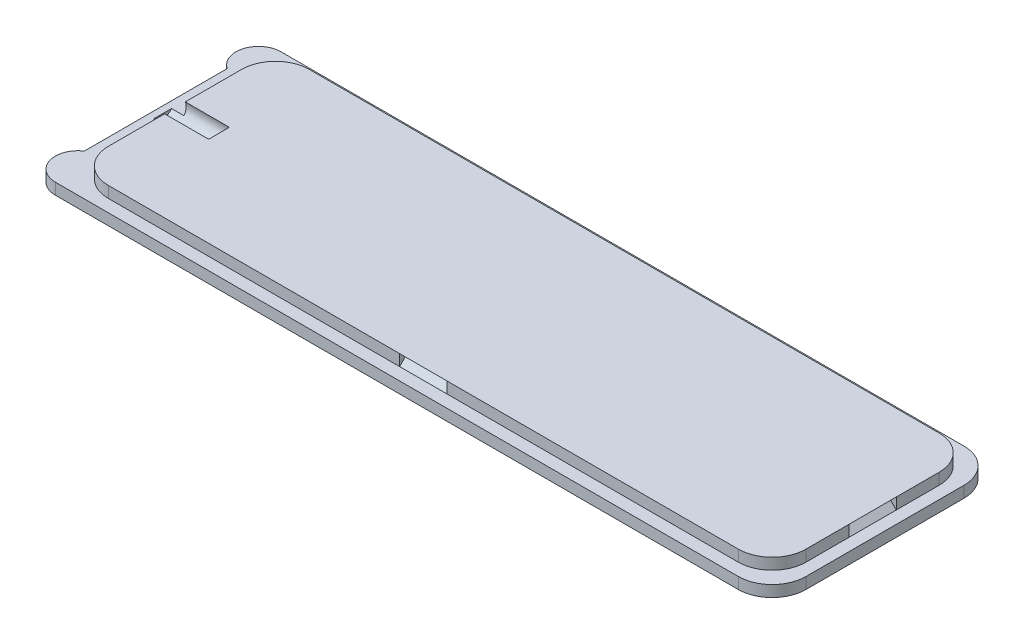
ISO-10303-21;
HEADER;
FILE_DESCRIPTION(('STEP AP214'),'2;1');
FILE_NAME('part.step','',(''),(''),'','','');
FILE_SCHEMA(('AUTOMOTIVE_DESIGN { 1 0 10303 214 1 1 1 1 }'));
ENDSEC;
DATA;
#1=APPLICATION_CONTEXT('core data for automotive mechanical design processes');
#2=APPLICATION_PROTOCOL_DEFINITION('international standard','automotive_design',2000,#1);
#3=PRODUCT_CONTEXT('',#1,'mechanical');
#4=PRODUCT('Part','Part','',(#3));
#5=PRODUCT_RELATED_PRODUCT_CATEGORY('part','',(#4));
#6=PRODUCT_DEFINITION_FORMATION('','',#4);
#7=PRODUCT_DEFINITION_CONTEXT('part definition',#1,'design');
#8=PRODUCT_DEFINITION('design','',#6,#7);
#9=PRODUCT_DEFINITION_SHAPE('','',#8);
#10=(LENGTH_UNIT() NAMED_UNIT(*) SI_UNIT(.MILLI.,.METRE.));
#11=(NAMED_UNIT(*) PLANE_ANGLE_UNIT() SI_UNIT($,.RADIAN.));
#12=(NAMED_UNIT(*) SI_UNIT($,.STERADIAN.) SOLID_ANGLE_UNIT());
#13=UNCERTAINTY_MEASURE_WITH_UNIT(LENGTH_MEASURE(1.E-05),#10,'distance_accuracy_value','');
#14=(GEOMETRIC_REPRESENTATION_CONTEXT(3) GLOBAL_UNCERTAINTY_ASSIGNED_CONTEXT((#13)) GLOBAL_UNIT_ASSIGNED_CONTEXT((#10,
#11,#12)) REPRESENTATION_CONTEXT('',''));
#15=CARTESIAN_POINT('',(0.,0.,0.));
#16=DIRECTION('',(0.,0.,1.));
#17=DIRECTION('',(1.,0.,0.));
#18=AXIS2_PLACEMENT_3D('',#15,#16,#17);
#19=CARTESIAN_POINT('',(305.,5.,-85.));
#20=DIRECTION('',(0.,-1.,0.));
#21=DIRECTION('',(0.,0.,-1.));
#22=AXIS2_PLACEMENT_3D('',#19,#20,#21);
#23=PLANE('',#22);
#24=DIRECTION('',(0.,0.,1.));
#25=VECTOR('',#24,1.);
#26=CARTESIAN_POINT('',(-3.,5.,0.));
#27=LINE('',#26,#25);
#28=CARTESIAN_POINT('',(-3.,5.,-81.6483534557551));
#29=VERTEX_POINT('',#28);
#30=CARTESIAN_POINT('',(-3.,5.,-18.351646544245));
#31=VERTEX_POINT('',#30);
#32=EDGE_CURVE('E272',#29,#31,#27,.T.);
#33=ORIENTED_EDGE('',*,*,#32,.T.);
#34=CARTESIAN_POINT('',(2.50000000000012,5.,-10.));
#35=DIRECTION('',(0.,1.,0.));
#36=DIRECTION('',(0.,0.,1.));
#37=AXIS2_PLACEMENT_3D('',#34,#35,#36);
#38=CIRCLE('',#37,10.);
#39=CARTESIAN_POINT('',(2.50000000000019,5.,0.));
#40=VERTEX_POINT('',#39);
#41=EDGE_CURVE('E255',#40,#31,#38,.F.);
#42=ORIENTED_EDGE('',*,*,#41,.F.);
#43=DIRECTION('',(1.,0.,0.));
#44=VECTOR('',#43,1.);
#45=CARTESIAN_POINT('',(15.0000000000001,5.,0.));
#46=LINE('',#45,#44);
#47=CARTESIAN_POINT('',(305.,5.,0.));
#48=VERTEX_POINT('',#47);
#49=EDGE_CURVE('E522',#40,#48,#46,.T.);
#50=ORIENTED_EDGE('',*,*,#49,.T.);
#51=CARTESIAN_POINT('',(305.,5.,-15.));
#52=DIRECTION('',(0.,1.,0.));
#53=DIRECTION('',(0.,0.,-1.));
#54=AXIS2_PLACEMENT_3D('',#51,#52,#53);
#55=CIRCLE('',#54,15.);
#56=CARTESIAN_POINT('',(320.,5.,-15.0000000000001));
#57=VERTEX_POINT('',#56);
#58=EDGE_CURVE('E525',#48,#57,#55,.T.);
#59=ORIENTED_EDGE('',*,*,#58,.T.);
#60=DIRECTION('',(0.,0.,-1.));
#61=VECTOR('',#60,1.);
#62=CARTESIAN_POINT('',(320.,5.,-15.0000000000001));
#63=LINE('',#62,#61);
#64=CARTESIAN_POINT('',(320.,5.,-84.9999999999999));
#65=VERTEX_POINT('',#64);
#66=EDGE_CURVE('E528',#57,#65,#63,.T.);
#67=ORIENTED_EDGE('',*,*,#66,.T.);
#68=CARTESIAN_POINT('',(305.,5.,-85.));
#69=DIRECTION('',(0.,1.,0.));
#70=DIRECTION('',(0.,0.,-1.));
#71=AXIS2_PLACEMENT_3D('',#68,#69,#70);
#72=CIRCLE('',#71,15.);
#73=CARTESIAN_POINT('',(305.,5.,-100.));
#74=VERTEX_POINT('',#73);
#75=EDGE_CURVE('E493',#65,#74,#72,.T.);
#76=ORIENTED_EDGE('',*,*,#75,.T.);
#77=DIRECTION('',(-1.,0.,0.));
#78=VECTOR('',#77,1.);
#79=CARTESIAN_POINT('',(15.0000000000001,5.,-100.));
#80=LINE('',#79,#78);
#81=CARTESIAN_POINT('',(2.50000000000017,5.,-100.));
#82=VERTEX_POINT('',#81);
#83=EDGE_CURVE('E519',#74,#82,#80,.T.);
#84=ORIENTED_EDGE('',*,*,#83,.T.);
#85=CARTESIAN_POINT('',(2.5000000000001,5.,-90.));
#86=DIRECTION('',(0.,1.,0.));
#87=DIRECTION('',(0.,0.,1.));
#88=AXIS2_PLACEMENT_3D('',#85,#86,#87);
#89=CIRCLE('',#88,9.99999999999999);
#90=EDGE_CURVE('E281',#29,#82,#89,.F.);
#91=ORIENTED_EDGE('',*,*,#90,.F.);
#92=EDGE_LOOP('',(#33,#42,#50,#59,#67,#76,#84,#91));
#93=FACE_BOUND('',#92,.T.);
#94=DIRECTION('',(0.,0.,-1.));
#95=VECTOR('',#94,1.);
#96=CARTESIAN_POINT('',(0.,5.,-15.0000000000001));
#97=LINE('',#96,#95);
#98=CARTESIAN_POINT('',(0.,5.,-46.));
#99=VERTEX_POINT('',#98);
#100=CARTESIAN_POINT('',(0.,5.,-54.));
#101=VERTEX_POINT('',#100);
#102=EDGE_CURVE('E295',#99,#101,#97,.T.);
#103=ORIENTED_EDGE('',*,*,#102,.T.);
#104=DIRECTION('',(-1.,0.,0.));
#105=VECTOR('',#104,1.);
#106=CARTESIAN_POINT('',(25.,5.,-54.));
#107=LINE('',#106,#105);
#108=CARTESIAN_POINT('',(5.5,5.,-54.));
#109=VERTEX_POINT('',#108);
#110=EDGE_CURVE('E316',#109,#101,#107,.T.);
#111=ORIENTED_EDGE('',*,*,#110,.F.);
#112=DIRECTION('',(0.,0.,1.));
#113=VECTOR('',#112,1.);
#114=CARTESIAN_POINT('',(5.5,5.,-79.4999999999999));
#115=LINE('',#114,#113);
#116=CARTESIAN_POINT('',(5.5,5.,-79.4999999999999));
#117=VERTEX_POINT('',#116);
#118=EDGE_CURVE('E432',#117,#109,#115,.T.);
#119=ORIENTED_EDGE('',*,*,#118,.F.);
#120=CARTESIAN_POINT('',(20.5,5.,-79.5));
#121=DIRECTION('',(0.,1.,0.));
#122=DIRECTION('',(0.,0.,-1.));
#123=AXIS2_PLACEMENT_3D('',#120,#121,#122);
#124=CIRCLE('',#123,15.);
#125=CARTESIAN_POINT('',(20.5000000000001,5.,-94.5));
#126=VERTEX_POINT('',#125);
#127=EDGE_CURVE('E427',#126,#117,#124,.T.);
#128=ORIENTED_EDGE('',*,*,#127,.F.);
#129=DIRECTION('',(-1.,0.,0.));
#130=VECTOR('',#129,1.);
#131=CARTESIAN_POINT('',(20.5000000000001,5.,-94.5));
#132=LINE('',#131,#130);
#133=CARTESIAN_POINT('',(149.5,5.,-94.5));
#134=VERTEX_POINT('',#133);
#135=EDGE_CURVE('E421',#134,#126,#132,.T.);
#136=ORIENTED_EDGE('',*,*,#135,.F.);
#137=DIRECTION('',(-1.,0.,0.));
#138=VECTOR('',#137,1.);
#139=CARTESIAN_POINT('',(170.5,5.,-94.5));
#140=LINE('',#139,#138);
#141=CARTESIAN_POINT('',(170.5,5.,-94.5));
#142=VERTEX_POINT('',#141);
#143=EDGE_CURVE('E381',#142,#134,#140,.T.);
#144=ORIENTED_EDGE('',*,*,#143,.F.);
#145=CARTESIAN_POINT('',(299.5,5.,-94.5));
#146=VERTEX_POINT('',#145);
#147=EDGE_CURVE('E423',#146,#142,#132,.T.);
#148=ORIENTED_EDGE('',*,*,#147,.F.);
#149=CARTESIAN_POINT('',(299.5,5.,-79.5));
#150=DIRECTION('',(0.,1.,0.));
#151=DIRECTION('',(0.,0.,-1.));
#152=AXIS2_PLACEMENT_3D('',#149,#150,#151);
#153=CIRCLE('',#152,15.);
#154=CARTESIAN_POINT('',(314.5,5.,-79.4999999999999));
#155=VERTEX_POINT('',#154);
#156=EDGE_CURVE('E417',#155,#146,#153,.T.);
#157=ORIENTED_EDGE('',*,*,#156,.F.);
#158=DIRECTION('',(0.,0.,-1.));
#159=VECTOR('',#158,1.);
#160=CARTESIAN_POINT('',(314.5,5.,-79.4999999999999));
#161=LINE('',#160,#159);
#162=CARTESIAN_POINT('',(314.5,5.,-60.5));
#163=VERTEX_POINT('',#162);
#164=EDGE_CURVE('E449',#163,#155,#161,.T.);
#165=ORIENTED_EDGE('',*,*,#164,.F.);
#166=DIRECTION('',(0.,0.,-1.));
#167=VECTOR('',#166,1.);
#168=CARTESIAN_POINT('',(314.5,5.,-39.5));
#169=LINE('',#168,#167);
#170=CARTESIAN_POINT('',(314.5,5.,-39.5));
#171=VERTEX_POINT('',#170);
#172=EDGE_CURVE('E350',#171,#163,#169,.T.);
#173=ORIENTED_EDGE('',*,*,#172,.F.);
#174=CARTESIAN_POINT('',(314.5,5.,-20.5000000000001));
#175=VERTEX_POINT('',#174);
#176=EDGE_CURVE('E450',#175,#171,#161,.T.);
#177=ORIENTED_EDGE('',*,*,#176,.F.);
#178=CARTESIAN_POINT('',(299.5,5.,-20.5));
#179=DIRECTION('',(0.,1.,0.));
#180=DIRECTION('',(0.,0.,-1.));
#181=AXIS2_PLACEMENT_3D('',#178,#179,#180);
#182=CIRCLE('',#181,15.);
#183=CARTESIAN_POINT('',(299.5,5.,-5.5));
#184=VERTEX_POINT('',#183);
#185=EDGE_CURVE('E445',#184,#175,#182,.T.);
#186=ORIENTED_EDGE('',*,*,#185,.F.);
#187=DIRECTION('',(1.,0.,0.));
#188=VECTOR('',#187,1.);
#189=CARTESIAN_POINT('',(20.5000000000001,5.,-5.5));
#190=LINE('',#189,#188);
#191=CARTESIAN_POINT('',(170.5,5.,-5.5));
#192=VERTEX_POINT('',#191);
#193=EDGE_CURVE('E440',#192,#184,#190,.T.);
#194=ORIENTED_EDGE('',*,*,#193,.F.);
#195=DIRECTION('',(-1.,0.,0.));
#196=VECTOR('',#195,1.);
#197=CARTESIAN_POINT('',(170.5,5.,-5.5));
#198=LINE('',#197,#196);
#199=CARTESIAN_POINT('',(149.5,5.,-5.5));
#200=VERTEX_POINT('',#199);
#201=EDGE_CURVE('E390',#192,#200,#198,.T.);
#202=ORIENTED_EDGE('',*,*,#201,.T.);
#203=CARTESIAN_POINT('',(20.5000000000001,5.,-5.5));
#204=VERTEX_POINT('',#203);
#205=EDGE_CURVE('E441',#204,#200,#190,.T.);
#206=ORIENTED_EDGE('',*,*,#205,.F.);
#207=CARTESIAN_POINT('',(20.5,5.,-20.5));
#208=DIRECTION('',(0.,1.,0.));
#209=DIRECTION('',(0.,0.,-1.));
#210=AXIS2_PLACEMENT_3D('',#207,#208,#209);
#211=CIRCLE('',#210,15.);
#212=CARTESIAN_POINT('',(5.50000000000001,5.,-20.5000000000001));
#213=VERTEX_POINT('',#212);
#214=EDGE_CURVE('E436',#213,#204,#211,.T.);
#215=ORIENTED_EDGE('',*,*,#214,.F.);
#216=CARTESIAN_POINT('',(5.50000000000001,5.,-46.));
#217=VERTEX_POINT('',#216);
#218=EDGE_CURVE('E431',#217,#213,#115,.T.);
#219=ORIENTED_EDGE('',*,*,#218,.F.);
#220=DIRECTION('',(-1.,0.,0.));
#221=VECTOR('',#220,1.);
#222=CARTESIAN_POINT('',(25.,5.,-46.));
#223=LINE('',#222,#221);
#224=EDGE_CURVE('E320',#99,#217,#223,.F.);
#225=ORIENTED_EDGE('',*,*,#224,.F.);
#226=EDGE_LOOP('',(#103,#111,#119,#128,#136,#144,#148,#157,#165,#173,#177,#186,#194,#202,#206,
#215,#219,#225));
#227=FACE_BOUND('',#226,.T.);
#228=ADVANCED_FACE('F64',(#93,#227),#23,.F.);
#229=CARTESIAN_POINT('',(15.0000000000001,10.,-100.));
#230=DIRECTION('',(0.,0.,1.));
#231=DIRECTION('',(1.,0.,0.));
#232=AXIS2_PLACEMENT_3D('',#229,#230,#231);
#233=PLANE('',#232);
#234=DIRECTION('',(0.,-1.,0.));
#235=VECTOR('',#234,1.);
#236=CARTESIAN_POINT('',(2.50000000000017,5.,-100.));
#237=LINE('',#236,#235);
#238=CARTESIAN_POINT('',(2.50000000000017,0.,-100.));
#239=VERTEX_POINT('',#238);
#240=EDGE_CURVE('E292',#82,#239,#237,.T.);
#241=ORIENTED_EDGE('',*,*,#240,.F.);
#242=ORIENTED_EDGE('',*,*,#83,.F.);
#243=DIRECTION('',(0.,-1.,0.));
#244=VECTOR('',#243,1.);
#245=CARTESIAN_POINT('',(305.,10.,-100.));
#246=LINE('',#245,#244);
#247=CARTESIAN_POINT('',(305.,0.,-100.));
#248=VERTEX_POINT('',#247);
#249=EDGE_CURVE('E560',#74,#248,#246,.T.);
#250=ORIENTED_EDGE('',*,*,#249,.T.);
#251=DIRECTION('',(-1.,0.,0.));
#252=VECTOR('',#251,1.);
#253=CARTESIAN_POINT('',(15.0000000000001,0.,-100.));
#254=LINE('',#253,#252);
#255=EDGE_CURVE('E535',#248,#239,#254,.T.);
#256=ORIENTED_EDGE('',*,*,#255,.T.);
#257=EDGE_LOOP('',(#241,#242,#250,#256));
#258=FACE_BOUND('',#257,.T.);
#259=ADVANCED_FACE('F606',(#258),#233,.F.);
#260=CARTESIAN_POINT('',(305.,0.,-85.));
#261=DIRECTION('',(0.,-1.,0.));
#262=DIRECTION('',(0.,0.,-1.));
#263=AXIS2_PLACEMENT_3D('',#260,#261,#262);
#264=PLANE('',#263);
#265=CARTESIAN_POINT('',(2.50000000000012,0.,-10.));
#266=DIRECTION('',(0.,1.,0.));
#267=DIRECTION('',(0.,0.,1.));
#268=AXIS2_PLACEMENT_3D('',#265,#266,#267);
#269=CIRCLE('',#268,10.);
#270=CARTESIAN_POINT('',(2.50000000000019,0.,0.));
#271=VERTEX_POINT('',#270);
#272=CARTESIAN_POINT('',(-3.,0.,-18.351646544245));
#273=VERTEX_POINT('',#272);
#274=EDGE_CURVE('E266',#271,#273,#269,.F.);
#275=ORIENTED_EDGE('',*,*,#274,.T.);
#276=DIRECTION('',(0.,0.,1.));
#277=VECTOR('',#276,1.);
#278=CARTESIAN_POINT('',(-3.,0.,0.));
#279=LINE('',#278,#277);
#280=CARTESIAN_POINT('',(-3.,0.,-81.6483534557551));
#281=VERTEX_POINT('',#280);
#282=EDGE_CURVE('E274',#281,#273,#279,.T.);
#283=ORIENTED_EDGE('',*,*,#282,.F.);
#284=CARTESIAN_POINT('',(2.5000000000001,0.,-90.));
#285=DIRECTION('',(0.,1.,0.));
#286=DIRECTION('',(0.,0.,1.));
#287=AXIS2_PLACEMENT_3D('',#284,#285,#286);
#288=CIRCLE('',#287,9.99999999999999);
#289=EDGE_CURVE('E276',#281,#239,#288,.F.);
#290=ORIENTED_EDGE('',*,*,#289,.T.);
#291=ORIENTED_EDGE('',*,*,#255,.F.);
#292=CARTESIAN_POINT('',(305.,0.,-85.));
#293=DIRECTION('',(0.,1.,0.));
#294=DIRECTION('',(0.,0.,-1.));
#295=AXIS2_PLACEMENT_3D('',#292,#293,#294);
#296=CIRCLE('',#295,15.);
#297=CARTESIAN_POINT('',(320.,0.,-84.9999999999999));
#298=VERTEX_POINT('',#297);
#299=EDGE_CURVE('E531',#298,#248,#296,.T.);
#300=ORIENTED_EDGE('',*,*,#299,.F.);
#301=DIRECTION('',(0.,0.,-1.));
#302=VECTOR('',#301,1.);
#303=CARTESIAN_POINT('',(320.,0.,-15.0000000000001));
#304=LINE('',#303,#302);
#305=CARTESIAN_POINT('',(320.,0.,-15.0000000000001));
#306=VERTEX_POINT('',#305);
#307=EDGE_CURVE('E546',#306,#298,#304,.T.);
#308=ORIENTED_EDGE('',*,*,#307,.F.);
#309=CARTESIAN_POINT('',(305.,0.,-15.));
#310=DIRECTION('',(0.,1.,0.));
#311=DIRECTION('',(0.,0.,-1.));
#312=AXIS2_PLACEMENT_3D('',#309,#310,#311);
#313=CIRCLE('',#312,15.);
#314=CARTESIAN_POINT('',(305.,0.,0.));
#315=VERTEX_POINT('',#314);
#316=EDGE_CURVE('E542',#315,#306,#313,.T.);
#317=ORIENTED_EDGE('',*,*,#316,.F.);
#318=DIRECTION('',(1.,0.,0.));
#319=VECTOR('',#318,1.);
#320=CARTESIAN_POINT('',(15.0000000000001,0.,0.));
#321=LINE('',#320,#319);
#322=EDGE_CURVE('E539',#271,#315,#321,.T.);
#323=ORIENTED_EDGE('',*,*,#322,.F.);
#324=EDGE_LOOP('',(#275,#283,#290,#291,#300,#308,#317,#323));
#325=FACE_BOUND('',#324,.T.);
#326=ADVANCED_FACE('F611',(#325),#264,.T.);
#327=CARTESIAN_POINT('',(5.5,5.,-79.4999999999999));
#328=DIRECTION('',(-1.,0.,0.));
#329=DIRECTION('',(0.,0.,1.));
#330=AXIS2_PLACEMENT_3D('',#327,#328,#329);
#331=PLANE('',#330);
#332=ORIENTED_EDGE('',*,*,#118,.T.);
#333=CARTESIAN_POINT('',(5.50000000000001,7.99999999999999,-50.));
#334=DIRECTION('',(-1.,0.,0.));
#335=DIRECTION('',(0.,0.,1.));
#336=AXIS2_PLACEMENT_3D('',#333,#334,#335);
#337=CIRCLE('',#336,5.);
#338=CARTESIAN_POINT('',(5.50000000000001,10.,-54.5825756949558));
#339=VERTEX_POINT('',#338);
#340=EDGE_CURVE('E309',#109,#339,#337,.F.);
#341=ORIENTED_EDGE('',*,*,#340,.T.);
#342=DIRECTION('',(0.,0.,1.));
#343=VECTOR('',#342,1.);
#344=CARTESIAN_POINT('',(5.5,10.,-79.4999999999999));
#345=LINE('',#344,#343);
#346=CARTESIAN_POINT('',(5.5,10.,-79.4999999999999));
#347=VERTEX_POINT('',#346);
#348=EDGE_CURVE('E468',#347,#339,#345,.T.);
#349=ORIENTED_EDGE('',*,*,#348,.F.);
#350=DIRECTION('',(0.,1.,0.));
#351=VECTOR('',#350,1.);
#352=CARTESIAN_POINT('',(5.5,5.,-79.4999999999999));
#353=LINE('',#352,#351);
#354=EDGE_CURVE('E508',#117,#347,#353,.T.);
#355=ORIENTED_EDGE('',*,*,#354,.F.);
#356=EDGE_LOOP('',(#332,#341,#349,#355));
#357=FACE_BOUND('',#356,.T.);
#358=ADVANCED_FACE('F574',(#357),#331,.T.);
#359=CARTESIAN_POINT('',(305.,10.,-85.));
#360=DIRECTION('',(0.,-1.,0.));
#361=DIRECTION('',(0.,0.,-1.));
#362=AXIS2_PLACEMENT_3D('',#359,#360,#361);
#363=PLANE('',#362);
#364=DIRECTION('',(-1.,0.,0.));
#365=VECTOR('',#364,1.);
#366=CARTESIAN_POINT('',(25.,10.,-45.4174243050442));
#367=LINE('',#366,#365);
#368=CARTESIAN_POINT('',(5.50000000000001,10.,-45.4174243050442));
#369=VERTEX_POINT('',#368);
#370=CARTESIAN_POINT('',(25.,10.,-45.4174243050442));
#371=VERTEX_POINT('',#370);
#372=EDGE_CURVE('E12',#369,#371,#367,.F.);
#373=ORIENTED_EDGE('',*,*,#372,.F.);
#374=CARTESIAN_POINT('',(5.50000000000001,10.,-20.5000000000001));
#375=VERTEX_POINT('',#374);
#376=EDGE_CURVE('E467',#369,#375,#345,.T.);
#377=ORIENTED_EDGE('',*,*,#376,.T.);
#378=CARTESIAN_POINT('',(20.5,10.,-20.5));
#379=DIRECTION('',(0.,1.,0.));
#380=DIRECTION('',(0.,0.,-1.));
#381=AXIS2_PLACEMENT_3D('',#378,#379,#380);
#382=CIRCLE('',#381,15.);
#383=CARTESIAN_POINT('',(20.5000000000001,10.,-5.5));
#384=VERTEX_POINT('',#383);
#385=EDGE_CURVE('E472',#375,#384,#382,.T.);
#386=ORIENTED_EDGE('',*,*,#385,.T.);
#387=DIRECTION('',(1.,0.,0.));
#388=VECTOR('',#387,1.);
#389=CARTESIAN_POINT('',(20.5000000000001,10.,-5.5));
#390=LINE('',#389,#388);
#391=CARTESIAN_POINT('',(149.5,10.,-5.5));
#392=VERTEX_POINT('',#391);
#393=EDGE_CURVE('E477',#384,#392,#390,.T.);
#394=ORIENTED_EDGE('',*,*,#393,.T.);
#395=DIRECTION('',(-1.,0.,0.));
#396=VECTOR('',#395,1.);
#397=CARTESIAN_POINT('',(170.5,10.,-5.5));
#398=LINE('',#397,#396);
#399=CARTESIAN_POINT('',(170.5,10.,-5.5));
#400=VERTEX_POINT('',#399);
#401=EDGE_CURVE('E353',#400,#392,#398,.T.);
#402=ORIENTED_EDGE('',*,*,#401,.F.);
#403=CARTESIAN_POINT('',(299.5,10.,-5.5));
#404=VERTEX_POINT('',#403);
#405=EDGE_CURVE('E476',#400,#404,#390,.T.);
#406=ORIENTED_EDGE('',*,*,#405,.T.);
#407=CARTESIAN_POINT('',(299.5,10.,-20.5));
#408=DIRECTION('',(0.,1.,0.));
#409=DIRECTION('',(0.,0.,-1.));
#410=AXIS2_PLACEMENT_3D('',#407,#408,#409);
#411=CIRCLE('',#410,15.);
#412=CARTESIAN_POINT('',(314.5,10.,-20.5000000000001));
#413=VERTEX_POINT('',#412);
#414=EDGE_CURVE('E481',#404,#413,#411,.T.);
#415=ORIENTED_EDGE('',*,*,#414,.T.);
#416=DIRECTION('',(0.,0.,-1.));
#417=VECTOR('',#416,1.);
#418=CARTESIAN_POINT('',(314.5,10.,-79.4999999999999));
#419=LINE('',#418,#417);
#420=CARTESIAN_POINT('',(314.5,10.,-39.5));
#421=VERTEX_POINT('',#420);
#422=EDGE_CURVE('E422',#413,#421,#419,.T.);
#423=ORIENTED_EDGE('',*,*,#422,.T.);
#424=DIRECTION('',(0.,0.,-1.));
#425=VECTOR('',#424,1.);
#426=CARTESIAN_POINT('',(314.5,10.,-39.5));
#427=LINE('',#426,#425);
#428=CARTESIAN_POINT('',(314.5,10.,-60.5));
#429=VERTEX_POINT('',#428);
#430=EDGE_CURVE('E346',#421,#429,#427,.T.);
#431=ORIENTED_EDGE('',*,*,#430,.T.);
#432=CARTESIAN_POINT('',(314.5,10.,-79.4999999999999));
#433=VERTEX_POINT('',#432);
#434=EDGE_CURVE('E485',#429,#433,#419,.T.);
#435=ORIENTED_EDGE('',*,*,#434,.T.);
#436=CARTESIAN_POINT('',(299.5,10.,-79.5));
#437=DIRECTION('',(0.,1.,0.));
#438=DIRECTION('',(0.,0.,-1.));
#439=AXIS2_PLACEMENT_3D('',#436,#437,#438);
#440=CIRCLE('',#439,15.);
#441=CARTESIAN_POINT('',(299.5,10.,-94.5));
#442=VERTEX_POINT('',#441);
#443=EDGE_CURVE('E387',#433,#442,#440,.T.);
#444=ORIENTED_EDGE('',*,*,#443,.T.);
#445=DIRECTION('',(-1.,0.,0.));
#446=VECTOR('',#445,1.);
#447=CARTESIAN_POINT('',(20.5000000000001,10.,-94.5));
#448=LINE('',#447,#446);
#449=CARTESIAN_POINT('',(170.5,10.,-94.5));
#450=VERTEX_POINT('',#449);
#451=EDGE_CURVE('E459',#442,#450,#448,.T.);
#452=ORIENTED_EDGE('',*,*,#451,.T.);
#453=DIRECTION('',(-1.,0.,0.));
#454=VECTOR('',#453,1.);
#455=CARTESIAN_POINT('',(170.5,10.,-94.5));
#456=LINE('',#455,#454);
#457=CARTESIAN_POINT('',(149.5,10.,-94.5));
#458=VERTEX_POINT('',#457);
#459=EDGE_CURVE('E377',#450,#458,#456,.T.);
#460=ORIENTED_EDGE('',*,*,#459,.T.);
#461=CARTESIAN_POINT('',(20.5000000000001,10.,-94.5));
#462=VERTEX_POINT('',#461);
#463=EDGE_CURVE('E458',#458,#462,#448,.T.);
#464=ORIENTED_EDGE('',*,*,#463,.T.);
#465=CARTESIAN_POINT('',(20.5,10.,-79.5));
#466=DIRECTION('',(0.,1.,0.));
#467=DIRECTION('',(0.,0.,-1.));
#468=AXIS2_PLACEMENT_3D('',#465,#466,#467);
#469=CIRCLE('',#468,15.);
#470=EDGE_CURVE('E463',#462,#347,#469,.T.);
#471=ORIENTED_EDGE('',*,*,#470,.T.);
#472=ORIENTED_EDGE('',*,*,#348,.T.);
#473=DIRECTION('',(-1.,0.,0.));
#474=VECTOR('',#473,1.);
#475=CARTESIAN_POINT('',(25.,10.,-54.5825756949558));
#476=LINE('',#475,#474);
#477=CARTESIAN_POINT('',(25.,10.,-54.5825756949558));
#478=VERTEX_POINT('',#477);
#479=EDGE_CURVE('E73',#478,#339,#476,.T.);
#480=ORIENTED_EDGE('',*,*,#479,.F.);
#481=DIRECTION('',(0.,0.,1.));
#482=VECTOR('',#481,1.);
#483=CARTESIAN_POINT('',(25.,10.,-85.));
#484=LINE('',#483,#482);
#485=EDGE_CURVE('E563',#478,#371,#484,.T.);
#486=ORIENTED_EDGE('',*,*,#485,.T.);
#487=EDGE_LOOP('',(#373,#377,#386,#394,#402,#406,#415,#423,#431,#435,#444,#452,#460,#464,#471,
#472,#480,#486));
#488=FACE_BOUND('',#487,.T.);
#489=ADVANCED_FACE('F577',(#488),#363,.F.);
#490=CARTESIAN_POINT('',(314.5,5.,-79.4999999999999));
#491=DIRECTION('',(1.,0.,0.));
#492=DIRECTION('',(0.,0.,-1.));
#493=AXIS2_PLACEMENT_3D('',#490,#491,#492);
#494=PLANE('',#493);
#495=ORIENTED_EDGE('',*,*,#176,.T.);
#496=DIRECTION('',(0.,1.,0.));
#497=VECTOR('',#496,1.);
#498=CARTESIAN_POINT('',(314.5,5.,-39.5));
#499=LINE('',#498,#497);
#500=EDGE_CURVE('E336',#171,#421,#499,.T.);
#501=ORIENTED_EDGE('',*,*,#500,.T.);
#502=ORIENTED_EDGE('',*,*,#422,.F.);
#503=DIRECTION('',(0.,1.,0.));
#504=VECTOR('',#503,1.);
#505=CARTESIAN_POINT('',(314.5,5.,-20.5000000000001));
#506=LINE('',#505,#504);
#507=EDGE_CURVE('E494',#175,#413,#506,.T.);
#508=ORIENTED_EDGE('',*,*,#507,.F.);
#509=EDGE_LOOP('',(#495,#501,#502,#508));
#510=FACE_BOUND('',#509,.T.);
#511=ADVANCED_FACE('F619',(#510),#494,.T.);
#512=CARTESIAN_POINT('',(20.5000000000001,5.,-5.5));
#513=DIRECTION('',(0.,0.,1.));
#514=DIRECTION('',(1.,0.,0.));
#515=AXIS2_PLACEMENT_3D('',#512,#513,#514);
#516=PLANE('',#515);
#517=ORIENTED_EDGE('',*,*,#405,.F.);
#518=DIRECTION('',(0.,-1.,0.));
#519=VECTOR('',#518,1.);
#520=CARTESIAN_POINT('',(170.5,10.,-5.5));
#521=LINE('',#520,#519);
#522=EDGE_CURVE('E400',#400,#192,#521,.T.);
#523=ORIENTED_EDGE('',*,*,#522,.T.);
#524=ORIENTED_EDGE('',*,*,#193,.T.);
#525=DIRECTION('',(0.,1.,0.));
#526=VECTOR('',#525,1.);
#527=CARTESIAN_POINT('',(299.5,5.,-5.5));
#528=LINE('',#527,#526);
#529=EDGE_CURVE('E497',#184,#404,#528,.T.);
#530=ORIENTED_EDGE('',*,*,#529,.T.);
#531=EDGE_LOOP('',(#517,#523,#524,#530));
#532=FACE_BOUND('',#531,.T.);
#533=ADVANCED_FACE('F655',(#532),#516,.T.);
#534=CARTESIAN_POINT('',(20.5000000000001,5.,-94.5));
#535=DIRECTION('',(0.,0.,-1.));
#536=DIRECTION('',(-1.,0.,0.));
#537=AXIS2_PLACEMENT_3D('',#534,#535,#536);
#538=PLANE('',#537);
#539=ORIENTED_EDGE('',*,*,#463,.F.);
#540=DIRECTION('',(0.,1.,0.));
#541=VECTOR('',#540,1.);
#542=CARTESIAN_POINT('',(149.5,10.,-94.5));
#543=LINE('',#542,#541);
#544=EDGE_CURVE('E363',#134,#458,#543,.T.);
#545=ORIENTED_EDGE('',*,*,#544,.F.);
#546=ORIENTED_EDGE('',*,*,#135,.T.);
#547=DIRECTION('',(0.,1.,0.));
#548=VECTOR('',#547,1.);
#549=CARTESIAN_POINT('',(20.5000000000001,5.,-94.5));
#550=LINE('',#549,#548);
#551=EDGE_CURVE('E511',#126,#462,#550,.T.);
#552=ORIENTED_EDGE('',*,*,#551,.T.);
#553=EDGE_LOOP('',(#539,#545,#546,#552));
#554=FACE_BOUND('',#553,.T.);
#555=ADVANCED_FACE('F584',(#554),#538,.T.);
#556=CARTESIAN_POINT('',(305.,10.,-85.));
#557=DIRECTION('',(0.,-1.,0.));
#558=DIRECTION('',(0.,0.,-1.));
#559=AXIS2_PLACEMENT_3D('',#556,#557,#558);
#560=CYLINDRICAL_SURFACE('',#559,15.);
#561=ORIENTED_EDGE('',*,*,#249,.F.);
#562=ORIENTED_EDGE('',*,*,#75,.F.);
#563=DIRECTION('',(0.,-1.,0.));
#564=VECTOR('',#563,1.);
#565=CARTESIAN_POINT('',(320.,10.,-84.9999999999999));
#566=LINE('',#565,#564);
#567=EDGE_CURVE('E550',#65,#298,#566,.T.);
#568=ORIENTED_EDGE('',*,*,#567,.T.);
#569=ORIENTED_EDGE('',*,*,#299,.T.);
#570=EDGE_LOOP('',(#561,#562,#568,#569));
#571=FACE_BOUND('',#570,.T.);
#572=ADVANCED_FACE('F66',(#571),#560,.T.);
#573=CARTESIAN_POINT('',(15.0000000000001,10.,0.));
#574=DIRECTION('',(0.,0.,-1.));
#575=DIRECTION('',(-1.,0.,0.));
#576=AXIS2_PLACEMENT_3D('',#573,#574,#575);
#577=PLANE('',#576);
#578=ORIENTED_EDGE('',*,*,#49,.F.);
#579=DIRECTION('',(0.,-1.,0.));
#580=VECTOR('',#579,1.);
#581=CARTESIAN_POINT('',(2.50000000000019,5.,0.));
#582=LINE('',#581,#580);
#583=EDGE_CURVE('E261',#40,#271,#582,.T.);
#584=ORIENTED_EDGE('',*,*,#583,.T.);
#585=ORIENTED_EDGE('',*,*,#322,.T.);
#586=DIRECTION('',(0.,-1.,0.));
#587=VECTOR('',#586,1.);
#588=CARTESIAN_POINT('',(305.,10.,0.));
#589=LINE('',#588,#587);
#590=EDGE_CURVE('E556',#48,#315,#589,.T.);
#591=ORIENTED_EDGE('',*,*,#590,.F.);
#592=EDGE_LOOP('',(#578,#584,#585,#591));
#593=FACE_BOUND('',#592,.T.);
#594=ADVANCED_FACE('F630',(#593),#577,.F.);
#595=CARTESIAN_POINT('',(305.,10.,-15.));
#596=DIRECTION('',(0.,-1.,0.));
#597=DIRECTION('',(0.,0.,-1.));
#598=AXIS2_PLACEMENT_3D('',#595,#596,#597);
#599=CYLINDRICAL_SURFACE('',#598,15.);
#600=DIRECTION('',(0.,-1.,0.));
#601=VECTOR('',#600,1.);
#602=CARTESIAN_POINT('',(320.,10.,-15.0000000000001));
#603=LINE('',#602,#601);
#604=EDGE_CURVE('E553',#57,#306,#603,.T.);
#605=ORIENTED_EDGE('',*,*,#604,.F.);
#606=ORIENTED_EDGE('',*,*,#58,.F.);
#607=ORIENTED_EDGE('',*,*,#590,.T.);
#608=ORIENTED_EDGE('',*,*,#316,.T.);
#609=EDGE_LOOP('',(#605,#606,#607,#608));
#610=FACE_BOUND('',#609,.T.);
#611=ADVANCED_FACE('F626',(#610),#599,.T.);
#612=CARTESIAN_POINT('',(320.,10.,-15.0000000000001));
#613=DIRECTION('',(-1.,0.,0.));
#614=DIRECTION('',(0.,0.,1.));
#615=AXIS2_PLACEMENT_3D('',#612,#613,#614);
#616=PLANE('',#615);
#617=ORIENTED_EDGE('',*,*,#567,.F.);
#618=ORIENTED_EDGE('',*,*,#66,.F.);
#619=ORIENTED_EDGE('',*,*,#604,.T.);
#620=ORIENTED_EDGE('',*,*,#307,.T.);
#621=EDGE_LOOP('',(#617,#618,#619,#620));
#622=FACE_BOUND('',#621,.T.);
#623=ADVANCED_FACE('F623',(#622),#616,.F.);
#624=CARTESIAN_POINT('',(299.5,5.,-79.5));
#625=DIRECTION('',(0.,1.,0.));
#626=DIRECTION('',(0.,0.,1.));
#627=AXIS2_PLACEMENT_3D('',#624,#625,#626);
#628=CYLINDRICAL_SURFACE('',#627,15.);
#629=ORIENTED_EDGE('',*,*,#443,.F.);
#630=DIRECTION('',(0.,1.,0.));
#631=VECTOR('',#630,1.);
#632=CARTESIAN_POINT('',(314.5,5.,-79.4999999999999));
#633=LINE('',#632,#631);
#634=EDGE_CURVE('E489',#155,#433,#633,.T.);
#635=ORIENTED_EDGE('',*,*,#634,.F.);
#636=ORIENTED_EDGE('',*,*,#156,.T.);
#637=DIRECTION('',(0.,1.,0.));
#638=VECTOR('',#637,1.);
#639=CARTESIAN_POINT('',(299.5,5.,-94.5));
#640=LINE('',#639,#638);
#641=EDGE_CURVE('E454',#146,#442,#640,.T.);
#642=ORIENTED_EDGE('',*,*,#641,.T.);
#643=EDGE_LOOP('',(#629,#635,#636,#642));
#644=FACE_BOUND('',#643,.T.);
#645=ADVANCED_FACE('F615',(#644),#628,.T.);
#646=DIRECTION('',(0.,1.,0.));
#647=VECTOR('',#646,1.);
#648=CARTESIAN_POINT('',(314.5,5.,-60.5));
#649=LINE('',#648,#647);
#650=EDGE_CURVE('E327',#163,#429,#649,.T.);
#651=ORIENTED_EDGE('',*,*,#650,.F.);
#652=ORIENTED_EDGE('',*,*,#164,.T.);
#653=ORIENTED_EDGE('',*,*,#634,.T.);
#654=ORIENTED_EDGE('',*,*,#434,.F.);
#655=EDGE_LOOP('',(#651,#652,#653,#654));
#656=FACE_BOUND('',#655,.T.);
#657=ADVANCED_FACE('F720',(#656),#494,.T.);
#658=CARTESIAN_POINT('',(299.5,5.,-20.5));
#659=DIRECTION('',(0.,1.,0.));
#660=DIRECTION('',(0.,0.,1.));
#661=AXIS2_PLACEMENT_3D('',#658,#659,#660);
#662=CYLINDRICAL_SURFACE('',#661,15.);
#663=ORIENTED_EDGE('',*,*,#414,.F.);
#664=ORIENTED_EDGE('',*,*,#529,.F.);
#665=ORIENTED_EDGE('',*,*,#185,.T.);
#666=ORIENTED_EDGE('',*,*,#507,.T.);
#667=EDGE_LOOP('',(#663,#664,#665,#666));
#668=FACE_BOUND('',#667,.T.);
#669=ADVANCED_FACE('F723',(#668),#662,.T.);
#670=DIRECTION('',(0.,-1.,0.));
#671=VECTOR('',#670,1.);
#672=CARTESIAN_POINT('',(149.5,10.,-5.5));
#673=LINE('',#672,#671);
#674=EDGE_CURVE('E411',#392,#200,#673,.T.);
#675=ORIENTED_EDGE('',*,*,#674,.F.);
#676=ORIENTED_EDGE('',*,*,#393,.F.);
#677=DIRECTION('',(0.,1.,0.));
#678=VECTOR('',#677,1.);
#679=CARTESIAN_POINT('',(20.5000000000001,5.,-5.5));
#680=LINE('',#679,#678);
#681=EDGE_CURVE('E501',#204,#384,#680,.T.);
#682=ORIENTED_EDGE('',*,*,#681,.F.);
#683=ORIENTED_EDGE('',*,*,#205,.T.);
#684=EDGE_LOOP('',(#675,#676,#682,#683));
#685=FACE_BOUND('',#684,.T.);
#686=ADVANCED_FACE('F662',(#685),#516,.T.);
#687=CARTESIAN_POINT('',(20.5,5.,-20.5));
#688=DIRECTION('',(0.,1.,0.));
#689=DIRECTION('',(0.,0.,1.));
#690=AXIS2_PLACEMENT_3D('',#687,#688,#689);
#691=CYLINDRICAL_SURFACE('',#690,15.);
#692=ORIENTED_EDGE('',*,*,#385,.F.);
#693=DIRECTION('',(0.,1.,0.));
#694=VECTOR('',#693,1.);
#695=CARTESIAN_POINT('',(5.50000000000001,5.,-20.5000000000001));
#696=LINE('',#695,#694);
#697=EDGE_CURVE('E504',#213,#375,#696,.T.);
#698=ORIENTED_EDGE('',*,*,#697,.F.);
#699=ORIENTED_EDGE('',*,*,#214,.T.);
#700=ORIENTED_EDGE('',*,*,#681,.T.);
#701=EDGE_LOOP('',(#692,#698,#699,#700));
#702=FACE_BOUND('',#701,.T.);
#703=ADVANCED_FACE('F729',(#702),#691,.T.);
#704=ORIENTED_EDGE('',*,*,#376,.F.);
#705=EDGE_CURVE('E317',#369,#217,#337,.F.);
#706=ORIENTED_EDGE('',*,*,#705,.T.);
#707=ORIENTED_EDGE('',*,*,#218,.T.);
#708=ORIENTED_EDGE('',*,*,#697,.T.);
#709=EDGE_LOOP('',(#704,#706,#707,#708));
#710=FACE_BOUND('',#709,.T.);
#711=ADVANCED_FACE('F674',(#710),#331,.T.);
#712=CARTESIAN_POINT('',(20.5,5.,-79.5));
#713=DIRECTION('',(0.,1.,0.));
#714=DIRECTION('',(0.,0.,1.));
#715=AXIS2_PLACEMENT_3D('',#712,#713,#714);
#716=CYLINDRICAL_SURFACE('',#715,15.);
#717=ORIENTED_EDGE('',*,*,#470,.F.);
#718=ORIENTED_EDGE('',*,*,#551,.F.);
#719=ORIENTED_EDGE('',*,*,#127,.T.);
#720=ORIENTED_EDGE('',*,*,#354,.T.);
#721=EDGE_LOOP('',(#717,#718,#719,#720));
#722=FACE_BOUND('',#721,.T.);
#723=ADVANCED_FACE('F582',(#722),#716,.T.);
#724=DIRECTION('',(0.,1.,0.));
#725=VECTOR('',#724,1.);
#726=CARTESIAN_POINT('',(170.5,10.,-94.5));
#727=LINE('',#726,#725);
#728=EDGE_CURVE('E373',#142,#450,#727,.T.);
#729=ORIENTED_EDGE('',*,*,#728,.T.);
#730=ORIENTED_EDGE('',*,*,#451,.F.);
#731=ORIENTED_EDGE('',*,*,#641,.F.);
#732=ORIENTED_EDGE('',*,*,#147,.T.);
#733=EDGE_LOOP('',(#729,#730,#731,#732));
#734=FACE_BOUND('',#733,.T.);
#735=ADVANCED_FACE('F656',(#734),#538,.T.);
#736=CARTESIAN_POINT('',(170.5,7.5,-7.9999999999999));
#737=DIRECTION('',(0.,-0.707106781186533,0.707106781186562));
#738=DIRECTION('',(0.,-0.707106781186562,-0.707106781186533));
#739=AXIS2_PLACEMENT_3D('',#736,#737,#738);
#740=PLANE('',#739);
#741=DIRECTION('',(-1.,0.,0.));
#742=VECTOR('',#741,1.);
#743=CARTESIAN_POINT('',(170.5,7.5,-7.9999999999999));
#744=LINE('',#743,#742);
#745=CARTESIAN_POINT('',(170.5,7.5,-7.9999999999999));
#746=VERTEX_POINT('',#745);
#747=CARTESIAN_POINT('',(149.5,7.5,-7.9999999999999));
#748=VERTEX_POINT('',#747);
#749=EDGE_CURVE('E394',#746,#748,#744,.T.);
#750=ORIENTED_EDGE('',*,*,#749,.F.);
#751=DIRECTION('',(0.,0.707106781186562,0.707106781186533));
#752=VECTOR('',#751,1.);
#753=CARTESIAN_POINT('',(170.5,7.5,-7.9999999999999));
#754=LINE('',#753,#752);
#755=EDGE_CURVE('E404',#746,#400,#754,.T.);
#756=ORIENTED_EDGE('',*,*,#755,.T.);
#757=ORIENTED_EDGE('',*,*,#401,.T.);
#758=DIRECTION('',(0.,0.707106781186562,0.707106781186533));
#759=VECTOR('',#758,1.);
#760=CARTESIAN_POINT('',(149.5,7.5,-7.9999999999999));
#761=LINE('',#760,#759);
#762=EDGE_CURVE('E359',#748,#392,#761,.T.);
#763=ORIENTED_EDGE('',*,*,#762,.F.);
#764=EDGE_LOOP('',(#750,#756,#757,#763));
#765=FACE_BOUND('',#764,.T.);
#766=ADVANCED_FACE('F665',(#765),#740,.T.);
#767=CARTESIAN_POINT('',(170.5,5.,-5.5));
#768=DIRECTION('',(0.,0.707106781186533,0.707106781186562));
#769=DIRECTION('',(0.,-0.707106781186562,0.707106781186533));
#770=AXIS2_PLACEMENT_3D('',#767,#768,#769);
#771=PLANE('',#770);
#772=ORIENTED_EDGE('',*,*,#201,.F.);
#773=DIRECTION('',(0.,0.707106781186562,-0.707106781186533));
#774=VECTOR('',#773,1.);
#775=CARTESIAN_POINT('',(170.5,5.,-5.5));
#776=LINE('',#775,#774);
#777=EDGE_CURVE('E397',#192,#746,#776,.T.);
#778=ORIENTED_EDGE('',*,*,#777,.T.);
#779=ORIENTED_EDGE('',*,*,#749,.T.);
#780=DIRECTION('',(0.,0.707106781186562,-0.707106781186533));
#781=VECTOR('',#780,1.);
#782=CARTESIAN_POINT('',(149.5,5.,-5.5));
#783=LINE('',#782,#781);
#784=EDGE_CURVE('E407',#200,#748,#783,.T.);
#785=ORIENTED_EDGE('',*,*,#784,.F.);
#786=EDGE_LOOP('',(#772,#778,#779,#785));
#787=FACE_BOUND('',#786,.T.);
#788=ADVANCED_FACE('F671',(#787),#771,.T.);
#789=CARTESIAN_POINT('',(170.5,0.,0.));
#790=DIRECTION('',(-1.,0.,0.));
#791=DIRECTION('',(0.,0.,1.));
#792=AXIS2_PLACEMENT_3D('',#789,#790,#791);
#793=PLANE('',#792);
#794=ORIENTED_EDGE('',*,*,#755,.F.);
#795=ORIENTED_EDGE('',*,*,#777,.F.);
#796=ORIENTED_EDGE('',*,*,#522,.F.);
#797=EDGE_LOOP('',(#794,#795,#796));
#798=FACE_BOUND('',#797,.T.);
#799=ADVANCED_FACE('F712',(#798),#793,.T.);
#800=CARTESIAN_POINT('',(149.5,0.,0.));
#801=DIRECTION('',(-1.,0.,0.));
#802=DIRECTION('',(0.,0.,1.));
#803=AXIS2_PLACEMENT_3D('',#800,#801,#802);
#804=PLANE('',#803);
#805=ORIENTED_EDGE('',*,*,#762,.T.);
#806=ORIENTED_EDGE('',*,*,#674,.T.);
#807=ORIENTED_EDGE('',*,*,#784,.T.);
#808=EDGE_LOOP('',(#805,#806,#807));
#809=FACE_BOUND('',#808,.T.);
#810=ADVANCED_FACE('F708',(#809),#804,.F.);
#811=CARTESIAN_POINT('',(170.5,7.5,-91.9999999999999));
#812=DIRECTION('',(0.,-0.707106781186564,-0.707106781186532));
#813=DIRECTION('',(0.,0.707106781186532,-0.707106781186564));
#814=AXIS2_PLACEMENT_3D('',#811,#812,#813);
#815=PLANE('',#814);
#816=ORIENTED_EDGE('',*,*,#459,.F.);
#817=DIRECTION('',(0.,-0.707106781186532,0.707106781186564));
#818=VECTOR('',#817,1.);
#819=CARTESIAN_POINT('',(170.5,7.5,-91.9999999999999));
#820=LINE('',#819,#818);
#821=CARTESIAN_POINT('',(170.5,7.5,-91.9999999999999));
#822=VERTEX_POINT('',#821);
#823=EDGE_CURVE('E366',#450,#822,#820,.T.);
#824=ORIENTED_EDGE('',*,*,#823,.T.);
#825=DIRECTION('',(-1.,0.,0.));
#826=VECTOR('',#825,1.);
#827=CARTESIAN_POINT('',(170.5,7.5,-91.9999999999999));
#828=LINE('',#827,#826);
#829=CARTESIAN_POINT('',(149.5,7.5,-91.9999999999999));
#830=VERTEX_POINT('',#829);
#831=EDGE_CURVE('E384',#822,#830,#828,.T.);
#832=ORIENTED_EDGE('',*,*,#831,.T.);
#833=DIRECTION('',(0.,-0.707106781186532,0.707106781186564));
#834=VECTOR('',#833,1.);
#835=CARTESIAN_POINT('',(149.5,7.5,-91.9999999999999));
#836=LINE('',#835,#834);
#837=EDGE_CURVE('E354',#458,#830,#836,.T.);
#838=ORIENTED_EDGE('',*,*,#837,.F.);
#839=EDGE_LOOP('',(#816,#824,#832,#838));
#840=FACE_BOUND('',#839,.T.);
#841=ADVANCED_FACE('F694',(#840),#815,.T.);
#842=CARTESIAN_POINT('',(170.5,5.,-94.5));
#843=DIRECTION('',(0.,0.707106781186564,-0.707106781186531));
#844=DIRECTION('',(0.,0.707106781186531,0.707106781186564));
#845=AXIS2_PLACEMENT_3D('',#842,#843,#844);
#846=PLANE('',#845);
#847=ORIENTED_EDGE('',*,*,#831,.F.);
#848=DIRECTION('',(0.,-0.707106781186531,-0.707106781186564));
#849=VECTOR('',#848,1.);
#850=CARTESIAN_POINT('',(170.5,5.,-94.5));
#851=LINE('',#850,#849);
#852=EDGE_CURVE('E370',#822,#142,#851,.T.);
#853=ORIENTED_EDGE('',*,*,#852,.T.);
#854=ORIENTED_EDGE('',*,*,#143,.T.);
#855=DIRECTION('',(0.,-0.707106781186531,-0.707106781186564));
#856=VECTOR('',#855,1.);
#857=CARTESIAN_POINT('',(149.5,5.,-94.5));
#858=LINE('',#857,#856);
#859=EDGE_CURVE('E358',#830,#134,#858,.T.);
#860=ORIENTED_EDGE('',*,*,#859,.F.);
#861=EDGE_LOOP('',(#847,#853,#854,#860));
#862=FACE_BOUND('',#861,.T.);
#863=ADVANCED_FACE('F689',(#862),#846,.T.);
#864=CARTESIAN_POINT('',(170.5,0.,0.));
#865=DIRECTION('',(1.,0.,0.));
#866=DIRECTION('',(0.,0.,-1.));
#867=AXIS2_PLACEMENT_3D('',#864,#865,#866);
#868=PLANE('',#867);
#869=ORIENTED_EDGE('',*,*,#823,.F.);
#870=ORIENTED_EDGE('',*,*,#728,.F.);
#871=ORIENTED_EDGE('',*,*,#852,.F.);
#872=EDGE_LOOP('',(#869,#870,#871));
#873=FACE_BOUND('',#872,.T.);
#874=ADVANCED_FACE('F695',(#873),#868,.F.);
#875=CARTESIAN_POINT('',(149.5,0.,0.));
#876=DIRECTION('',(1.,0.,0.));
#877=DIRECTION('',(0.,0.,-1.));
#878=AXIS2_PLACEMENT_3D('',#875,#876,#877);
#879=PLANE('',#878);
#880=ORIENTED_EDGE('',*,*,#837,.T.);
#881=ORIENTED_EDGE('',*,*,#859,.T.);
#882=ORIENTED_EDGE('',*,*,#544,.T.);
#883=EDGE_LOOP('',(#880,#881,#882));
#884=FACE_BOUND('',#883,.T.);
#885=ADVANCED_FACE('F691',(#884),#879,.T.);
#886=CARTESIAN_POINT('',(312.,7.5,-39.5));
#887=DIRECTION('',(0.707106781186555,0.70710678118654,0.));
#888=DIRECTION('',(-0.70710678118654,0.707106781186555,0.));
#889=AXIS2_PLACEMENT_3D('',#886,#887,#888);
#890=PLANE('',#889);
#891=DIRECTION('',(0.,0.,-1.));
#892=VECTOR('',#891,1.);
#893=CARTESIAN_POINT('',(312.,7.5,-39.5));
#894=LINE('',#893,#892);
#895=CARTESIAN_POINT('',(312.,7.5,-39.5));
#896=VERTEX_POINT('',#895);
#897=CARTESIAN_POINT('',(312.,7.5,-60.5));
#898=VERTEX_POINT('',#897);
#899=EDGE_CURVE('E343',#896,#898,#894,.T.);
#900=ORIENTED_EDGE('',*,*,#899,.F.);
#901=DIRECTION('',(0.70710678118654,-0.707106781186555,0.));
#902=VECTOR('',#901,1.);
#903=CARTESIAN_POINT('',(312.,7.5,-39.5));
#904=LINE('',#903,#902);
#905=EDGE_CURVE('E332',#896,#171,#904,.T.);
#906=ORIENTED_EDGE('',*,*,#905,.T.);
#907=ORIENTED_EDGE('',*,*,#172,.T.);
#908=DIRECTION('',(0.70710678118654,-0.707106781186555,0.));
#909=VECTOR('',#908,1.);
#910=CARTESIAN_POINT('',(312.,7.5,-60.5));
#911=LINE('',#910,#909);
#912=EDGE_CURVE('E323',#898,#163,#911,.T.);
#913=ORIENTED_EDGE('',*,*,#912,.F.);
#914=EDGE_LOOP('',(#900,#906,#907,#913));
#915=FACE_BOUND('',#914,.T.);
#916=ADVANCED_FACE('F702',(#915),#890,.T.);
#917=CARTESIAN_POINT('',(314.5,10.,-39.5));
#918=DIRECTION('',(0.707106781186555,-0.70710678118654,0.));
#919=DIRECTION('',(0.70710678118654,0.707106781186555,0.));
#920=AXIS2_PLACEMENT_3D('',#917,#918,#919);
#921=PLANE('',#920);
#922=ORIENTED_EDGE('',*,*,#430,.F.);
#923=DIRECTION('',(-0.70710678118654,-0.707106781186555,0.));
#924=VECTOR('',#923,1.);
#925=CARTESIAN_POINT('',(314.5,10.,-39.5));
#926=LINE('',#925,#924);
#927=EDGE_CURVE('E340',#421,#896,#926,.T.);
#928=ORIENTED_EDGE('',*,*,#927,.T.);
#929=ORIENTED_EDGE('',*,*,#899,.T.);
#930=DIRECTION('',(-0.70710678118654,-0.707106781186555,0.));
#931=VECTOR('',#930,1.);
#932=CARTESIAN_POINT('',(314.5,10.,-60.5));
#933=LINE('',#932,#931);
#934=EDGE_CURVE('E86',#429,#898,#933,.T.);
#935=ORIENTED_EDGE('',*,*,#934,.F.);
#936=EDGE_LOOP('',(#922,#928,#929,#935));
#937=FACE_BOUND('',#936,.T.);
#938=ADVANCED_FACE('F845',(#937),#921,.T.);
#939=CARTESIAN_POINT('',(0.,0.,-39.5));
#940=DIRECTION('',(0.,0.,-1.));
#941=DIRECTION('',(-1.,0.,0.));
#942=AXIS2_PLACEMENT_3D('',#939,#940,#941);
#943=PLANE('',#942);
#944=ORIENTED_EDGE('',*,*,#905,.F.);
#945=ORIENTED_EDGE('',*,*,#927,.F.);
#946=ORIENTED_EDGE('',*,*,#500,.F.);
#947=EDGE_LOOP('',(#944,#945,#946));
#948=FACE_BOUND('',#947,.T.);
#949=ADVANCED_FACE('F852',(#948),#943,.T.);
#950=CARTESIAN_POINT('',(0.,0.,-60.5));
#951=DIRECTION('',(0.,0.,-1.));
#952=DIRECTION('',(-1.,0.,0.));
#953=AXIS2_PLACEMENT_3D('',#950,#951,#952);
#954=PLANE('',#953);
#955=ORIENTED_EDGE('',*,*,#912,.T.);
#956=ORIENTED_EDGE('',*,*,#650,.T.);
#957=ORIENTED_EDGE('',*,*,#934,.T.);
#958=EDGE_LOOP('',(#955,#956,#957));
#959=FACE_BOUND('',#958,.T.);
#960=ADVANCED_FACE('F859',(#959),#954,.F.);
#961=CARTESIAN_POINT('',(25.,7.99999999999999,-50.));
#962=DIRECTION('',(-1.,0.,0.));
#963=DIRECTION('',(0.,0.,1.));
#964=AXIS2_PLACEMENT_3D('',#961,#962,#963);
#965=CYLINDRICAL_SURFACE('',#964,5.);
#966=ORIENTED_EDGE('',*,*,#224,.T.);
#967=ORIENTED_EDGE('',*,*,#705,.F.);
#968=ORIENTED_EDGE('',*,*,#372,.T.);
#969=CARTESIAN_POINT('',(25.,7.99999999999999,-50.));
#970=DIRECTION('',(1.,0.,0.));
#971=DIRECTION('',(0.,0.,-1.));
#972=AXIS2_PLACEMENT_3D('',#969,#970,#971);
#973=CIRCLE('',#972,5.);
#974=EDGE_CURVE('E79',#371,#478,#973,.T.);
#975=ORIENTED_EDGE('',*,*,#974,.T.);
#976=ORIENTED_EDGE('',*,*,#479,.T.);
#977=ORIENTED_EDGE('',*,*,#340,.F.);
#978=ORIENTED_EDGE('',*,*,#110,.T.);
#979=CARTESIAN_POINT('',(0.,7.99999999999999,-50.));
#980=DIRECTION('',(1.,0.,0.));
#981=DIRECTION('',(0.,0.,-1.));
#982=AXIS2_PLACEMENT_3D('',#979,#980,#981);
#983=CIRCLE('',#982,5.);
#984=EDGE_CURVE('E306',#99,#101,#983,.T.);
#985=ORIENTED_EDGE('',*,*,#984,.F.);
#986=EDGE_LOOP('',(#966,#967,#968,#975,#976,#977,#978,#985));
#987=FACE_BOUND('',#986,.T.);
#988=ADVANCED_FACE('F569',(#987),#965,.F.);
#989=CARTESIAN_POINT('',(25.,0.,0.));
#990=DIRECTION('',(1.,0.,0.));
#991=DIRECTION('',(0.,0.,-1.));
#992=AXIS2_PLACEMENT_3D('',#989,#990,#991);
#993=PLANE('',#992);
#994=ORIENTED_EDGE('',*,*,#974,.F.);
#995=ORIENTED_EDGE('',*,*,#485,.F.);
#996=EDGE_LOOP('',(#994,#995));
#997=FACE_BOUND('',#996,.T.);
#998=ADVANCED_FACE('F596',(#997),#993,.F.);
#999=CARTESIAN_POINT('',(0.,5.,-15.0000000000001));
#1000=DIRECTION('',(-1.,0.,0.));
#1001=DIRECTION('',(0.,0.,1.));
#1002=AXIS2_PLACEMENT_3D('',#999,#1000,#1001);
#1003=PLANE('',#1002);
#1004=ORIENTED_EDGE('',*,*,#984,.T.);
#1005=ORIENTED_EDGE('',*,*,#102,.F.);
#1006=EDGE_LOOP('',(#1004,#1005));
#1007=FACE_BOUND('',#1006,.T.);
#1008=ADVANCED_FACE('F593',(#1007),#1003,.F.);
#1009=CARTESIAN_POINT('',(2.5000000000001,5.,-90.));
#1010=DIRECTION('',(0.,-1.,0.));
#1011=DIRECTION('',(0.,0.,-1.));
#1012=AXIS2_PLACEMENT_3D('',#1009,#1010,#1011);
#1013=CYLINDRICAL_SURFACE('',#1012,9.99999999999999);
#1014=ORIENTED_EDGE('',*,*,#289,.F.);
#1015=DIRECTION('',(0.,-1.,0.));
#1016=VECTOR('',#1015,1.);
#1017=CARTESIAN_POINT('',(-3.,5.,-81.6483534557551));
#1018=LINE('',#1017,#1016);
#1019=EDGE_CURVE('E277',#29,#281,#1018,.T.);
#1020=ORIENTED_EDGE('',*,*,#1019,.F.);
#1021=ORIENTED_EDGE('',*,*,#90,.T.);
#1022=ORIENTED_EDGE('',*,*,#240,.T.);
#1023=EDGE_LOOP('',(#1014,#1020,#1021,#1022));
#1024=FACE_BOUND('',#1023,.T.);
#1025=ADVANCED_FACE('F595',(#1024),#1013,.T.);
#1026=CARTESIAN_POINT('',(2.50000000000012,5.,-10.));
#1027=DIRECTION('',(0.,-1.,0.));
#1028=DIRECTION('',(0.,0.,-1.));
#1029=AXIS2_PLACEMENT_3D('',#1026,#1027,#1028);
#1030=CYLINDRICAL_SURFACE('',#1029,10.);
#1031=ORIENTED_EDGE('',*,*,#274,.F.);
#1032=ORIENTED_EDGE('',*,*,#583,.F.);
#1033=ORIENTED_EDGE('',*,*,#41,.T.);
#1034=DIRECTION('',(0.,-1.,0.));
#1035=VECTOR('',#1034,1.);
#1036=CARTESIAN_POINT('',(-3.,5.,-18.351646544245));
#1037=LINE('',#1036,#1035);
#1038=EDGE_CURVE('E258',#31,#273,#1037,.T.);
#1039=ORIENTED_EDGE('',*,*,#1038,.T.);
#1040=EDGE_LOOP('',(#1031,#1032,#1033,#1039));
#1041=FACE_BOUND('',#1040,.T.);
#1042=ADVANCED_FACE('F257',(#1041),#1030,.T.);
#1043=CARTESIAN_POINT('',(-3.,5.,0.));
#1044=DIRECTION('',(1.,0.,0.));
#1045=DIRECTION('',(0.,0.,-1.));
#1046=AXIS2_PLACEMENT_3D('',#1043,#1044,#1045);
#1047=PLANE('',#1046);
#1048=ORIENTED_EDGE('',*,*,#282,.T.);
#1049=ORIENTED_EDGE('',*,*,#1038,.F.);
#1050=ORIENTED_EDGE('',*,*,#32,.F.);
#1051=ORIENTED_EDGE('',*,*,#1019,.T.);
#1052=EDGE_LOOP('',(#1048,#1049,#1050,#1051));
#1053=FACE_BOUND('',#1052,.T.);
#1054=ADVANCED_FACE('F270',(#1053),#1047,.F.);
#1055=CLOSED_SHELL('',(#228,#259,#326,#358,#489,#511,#533,#555,#572,#594,#611,#623,#645,#657,
#669,#686,#703,#711,#723,#735,#766,#788,#799,#810,#841,#863,#874,#885,#916,#938,#949,#960,#988,
#998,#1008,#1025,#1042,#1054));
#1056=MANIFOLD_SOLID_BREP('B2',#1055);
#1057=ADVANCED_BREP_SHAPE_REPRESENTATION('',(#18,#1056),#14);
#1058=SHAPE_DEFINITION_REPRESENTATION(#9,#1057);
ENDSEC;
END-ISO-10303-21;
